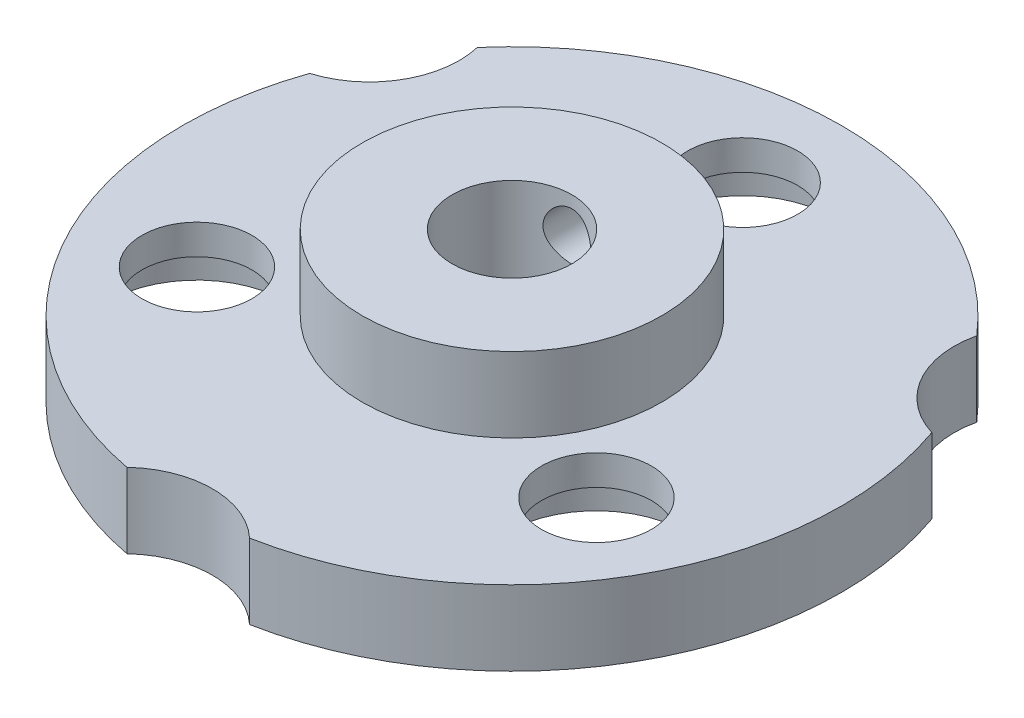
ISO-10303-21;
HEADER;
FILE_DESCRIPTION(('STEP AP214'),'2;1');
FILE_NAME('part.step','',(''),(''),'','','');
FILE_SCHEMA(('AUTOMOTIVE_DESIGN { 1 0 10303 214 1 1 1 1 }'));
ENDSEC;
DATA;
#1=APPLICATION_CONTEXT('core data for automotive mechanical design processes');
#2=APPLICATION_PROTOCOL_DEFINITION('international standard','automotive_design',2000,#1);
#3=PRODUCT_CONTEXT('',#1,'mechanical');
#4=PRODUCT('Part','Part','',(#3));
#5=PRODUCT_RELATED_PRODUCT_CATEGORY('part','',(#4));
#6=PRODUCT_DEFINITION_FORMATION('','',#4);
#7=PRODUCT_DEFINITION_CONTEXT('part definition',#1,'design');
#8=PRODUCT_DEFINITION('design','',#6,#7);
#9=PRODUCT_DEFINITION_SHAPE('','',#8);
#10=(LENGTH_UNIT() NAMED_UNIT(*) SI_UNIT(.MILLI.,.METRE.));
#11=(NAMED_UNIT(*) PLANE_ANGLE_UNIT() SI_UNIT($,.RADIAN.));
#12=(NAMED_UNIT(*) SI_UNIT($,.STERADIAN.) SOLID_ANGLE_UNIT());
#13=UNCERTAINTY_MEASURE_WITH_UNIT(LENGTH_MEASURE(1.E-05),#10,'distance_accuracy_value','');
#14=(GEOMETRIC_REPRESENTATION_CONTEXT(3) GLOBAL_UNCERTAINTY_ASSIGNED_CONTEXT((#13)) GLOBAL_UNIT_ASSIGNED_CONTEXT((#10,
#11,#12)) REPRESENTATION_CONTEXT('',''));
#15=CARTESIAN_POINT('',(0.,0.,0.));
#16=DIRECTION('',(0.,0.,1.));
#17=DIRECTION('',(1.,0.,0.));
#18=AXIS2_PLACEMENT_3D('',#15,#16,#17);
#19=CARTESIAN_POINT('',(0.,0.,-7.7));
#20=DIRECTION('',(0.,1.,0.));
#21=DIRECTION('',(0.,0.,1.));
#22=AXIS2_PLACEMENT_3D('',#19,#20,#21);
#23=CYLINDRICAL_SURFACE('',#22,1.83552150537951);
#24=CARTESIAN_POINT('',(0.,2.5,-7.7));
#25=DIRECTION('',(0.,1.,0.));
#26=DIRECTION('',(0.,0.,1.));
#27=AXIS2_PLACEMENT_3D('',#24,#25,#26);
#28=CIRCLE('',#27,1.83552150537951);
#29=CARTESIAN_POINT('',(0.,2.5,-5.86447849462049));
#30=VERTEX_POINT('',#29);
#31=EDGE_CURVE('E256',#30,#30,#28,.T.);
#32=ORIENTED_EDGE('',*,*,#31,.T.);
#33=EDGE_LOOP('',(#32));
#34=FACE_BOUND('',#33,.T.);
#35=CARTESIAN_POINT('',(0.,1.5,-7.7));
#36=DIRECTION('',(0.,-1.,0.));
#37=DIRECTION('',(0.,0.,-1.));
#38=AXIS2_PLACEMENT_3D('',#35,#36,#37);
#39=CIRCLE('',#38,1.83552150537951);
#40=CARTESIAN_POINT('',(0.,1.5,-9.5355215053795));
#41=VERTEX_POINT('',#40);
#42=EDGE_CURVE('E37',#41,#41,#39,.F.);
#43=ORIENTED_EDGE('',*,*,#42,.F.);
#44=EDGE_LOOP('',(#43));
#45=FACE_BOUND('',#44,.T.);
#46=ADVANCED_FACE('F33',(#34,#45),#23,.F.);
#47=CARTESIAN_POINT('',(-6.66839560914018,0.,3.85));
#48=DIRECTION('',(0.,1.,0.));
#49=DIRECTION('',(0.,0.,1.));
#50=AXIS2_PLACEMENT_3D('',#47,#48,#49);
#51=CYLINDRICAL_SURFACE('',#50,1.83552150537951);
#52=CARTESIAN_POINT('',(-6.66839560914018,2.5,3.85));
#53=DIRECTION('',(0.,1.,0.));
#54=DIRECTION('',(0.,0.,1.));
#55=AXIS2_PLACEMENT_3D('',#52,#53,#54);
#56=CIRCLE('',#55,1.83552150537951);
#57=CARTESIAN_POINT('',(-6.66839560914018,2.5,5.68552150537951));
#58=VERTEX_POINT('',#57);
#59=EDGE_CURVE('E260',#58,#58,#56,.T.);
#60=ORIENTED_EDGE('',*,*,#59,.T.);
#61=EDGE_LOOP('',(#60));
#62=FACE_BOUND('',#61,.T.);
#63=CARTESIAN_POINT('',(-6.66839560914018,1.5,3.85));
#64=DIRECTION('',(0.,-1.,0.));
#65=DIRECTION('',(0.,0.,-1.));
#66=AXIS2_PLACEMENT_3D('',#63,#64,#65);
#67=CIRCLE('',#66,1.83552150537951);
#68=CARTESIAN_POINT('',(-6.66839560914018,1.5,2.0144784946205));
#69=VERTEX_POINT('',#68);
#70=EDGE_CURVE('E127',#69,#69,#67,.F.);
#71=ORIENTED_EDGE('',*,*,#70,.F.);
#72=EDGE_LOOP('',(#71));
#73=FACE_BOUND('',#72,.T.);
#74=ADVANCED_FACE('F218',(#62,#73),#51,.F.);
#75=CARTESIAN_POINT('',(6.66839560914018,0.,3.85));
#76=DIRECTION('',(0.,1.,0.));
#77=DIRECTION('',(0.,0.,1.));
#78=AXIS2_PLACEMENT_3D('',#75,#76,#77);
#79=CYLINDRICAL_SURFACE('',#78,1.83552150537951);
#80=CARTESIAN_POINT('',(6.66839560914018,2.5,3.85));
#81=DIRECTION('',(0.,1.,0.));
#82=DIRECTION('',(0.,0.,1.));
#83=AXIS2_PLACEMENT_3D('',#80,#81,#82);
#84=CIRCLE('',#83,1.83552150537951);
#85=CARTESIAN_POINT('',(6.66839560914018,2.5,5.6855215053795));
#86=VERTEX_POINT('',#85);
#87=EDGE_CURVE('E257',#86,#86,#84,.T.);
#88=ORIENTED_EDGE('',*,*,#87,.T.);
#89=EDGE_LOOP('',(#88));
#90=FACE_BOUND('',#89,.T.);
#91=CARTESIAN_POINT('',(6.66839560914018,1.5,3.85));
#92=DIRECTION('',(0.,-1.,0.));
#93=DIRECTION('',(0.,0.,-1.));
#94=AXIS2_PLACEMENT_3D('',#91,#92,#93);
#95=CIRCLE('',#94,1.83552150537951);
#96=CARTESIAN_POINT('',(6.66839560914018,1.5,2.01447849462049));
#97=VERTEX_POINT('',#96);
#98=EDGE_CURVE('E103',#97,#97,#95,.F.);
#99=ORIENTED_EDGE('',*,*,#98,.F.);
#100=EDGE_LOOP('',(#99));
#101=FACE_BOUND('',#100,.T.);
#102=ADVANCED_FACE('F224',(#90,#101),#79,.F.);
#103=CARTESIAN_POINT('',(0.,2.5,0.));
#104=DIRECTION('',(0.,-1.,0.));
#105=DIRECTION('',(0.,0.,-1.));
#106=AXIS2_PLACEMENT_3D('',#103,#104,#105);
#107=CYLINDRICAL_SURFACE('',#106,11.);
#108=CARTESIAN_POINT('',(0.,0.,0.));
#109=DIRECTION('',(0.,1.,0.));
#110=DIRECTION('',(0.,0.,1.));
#111=AXIS2_PLACEMENT_3D('',#108,#109,#110);
#112=CIRCLE('',#111,11.);
#113=CARTESIAN_POINT('',(2.04787377107266,0.,10.8076923076924));
#114=VERTEX_POINT('',#113);
#115=CARTESIAN_POINT('',(10.3836729802836,0.,-3.63033544435343));
#116=VERTEX_POINT('',#115);
#117=EDGE_CURVE('E112',#114,#116,#112,.T.);
#118=ORIENTED_EDGE('',*,*,#117,.T.);
#119=DIRECTION('',(0.,1.,0.));
#120=VECTOR('',#119,1.);
#121=CARTESIAN_POINT('',(10.3836729802836,-0.25,-3.63033544435342));
#122=LINE('',#121,#120);
#123=CARTESIAN_POINT('',(10.3836729802836,2.5,-3.63033544435342));
#124=VERTEX_POINT('',#123);
#125=EDGE_CURVE('E50',#116,#124,#122,.T.);
#126=ORIENTED_EDGE('',*,*,#125,.T.);
#127=CARTESIAN_POINT('',(0.,2.5,0.));
#128=DIRECTION('',(0.,1.,0.));
#129=DIRECTION('',(0.,0.,1.));
#130=AXIS2_PLACEMENT_3D('',#127,#128,#129);
#131=CIRCLE('',#130,11.);
#132=CARTESIAN_POINT('',(2.04787377107267,2.5,10.8076923076924));
#133=VERTEX_POINT('',#132);
#134=EDGE_CURVE('E102',#133,#124,#131,.T.);
#135=ORIENTED_EDGE('',*,*,#134,.F.);
#136=DIRECTION('',(0.,1.,0.));
#137=VECTOR('',#136,1.);
#138=CARTESIAN_POINT('',(2.04787377107266,-0.25,10.8076923076924));
#139=LINE('',#138,#137);
#140=EDGE_CURVE('E151',#133,#114,#139,.F.);
#141=ORIENTED_EDGE('',*,*,#140,.T.);
#142=EDGE_LOOP('',(#118,#126,#135,#141));
#143=FACE_BOUND('',#142,.T.);
#144=ADVANCED_FACE('F243',(#143),#107,.T.);
#145=CARTESIAN_POINT('',(-10.3836729802836,0.,-3.6303354443534));
#146=VERTEX_POINT('',#145);
#147=CARTESIAN_POINT('',(-2.04787377107266,0.,10.8076923076924));
#148=VERTEX_POINT('',#147);
#149=EDGE_CURVE('E108',#146,#148,#112,.T.);
#150=ORIENTED_EDGE('',*,*,#149,.T.);
#151=DIRECTION('',(0.,1.,0.));
#152=VECTOR('',#151,1.);
#153=CARTESIAN_POINT('',(-2.04787377107266,-0.25,10.8076923076924));
#154=LINE('',#153,#152);
#155=CARTESIAN_POINT('',(-2.04787377107267,2.5,10.8076923076924));
#156=VERTEX_POINT('',#155);
#157=EDGE_CURVE('E57',#148,#156,#154,.T.);
#158=ORIENTED_EDGE('',*,*,#157,.T.);
#159=CARTESIAN_POINT('',(-10.3836729802836,2.5,-3.63033544435341));
#160=VERTEX_POINT('',#159);
#161=EDGE_CURVE('E110',#160,#156,#131,.T.);
#162=ORIENTED_EDGE('',*,*,#161,.F.);
#163=DIRECTION('',(0.,1.,0.));
#164=VECTOR('',#163,1.);
#165=CARTESIAN_POINT('',(-10.3836729802836,-0.25,-3.63033544435341));
#166=LINE('',#165,#164);
#167=EDGE_CURVE('E157',#160,#146,#166,.F.);
#168=ORIENTED_EDGE('',*,*,#167,.T.);
#169=EDGE_LOOP('',(#150,#158,#162,#168));
#170=FACE_BOUND('',#169,.T.);
#171=ADVANCED_FACE('F232',(#170),#107,.T.);
#172=CARTESIAN_POINT('',(0.,2.5,0.));
#173=DIRECTION('',(0.,1.,0.));
#174=DIRECTION('',(0.,0.,1.));
#175=AXIS2_PLACEMENT_3D('',#172,#173,#174);
#176=PLANE('',#175);
#177=CARTESIAN_POINT('',(11.258330249198,2.5,-6.50000000000016));
#178=DIRECTION('',(0.,1.,0.));
#179=DIRECTION('',(0.,0.,1.));
#180=AXIS2_PLACEMENT_3D('',#177,#178,#179);
#181=CIRCLE('',#180,3.);
#182=CARTESIAN_POINT('',(8.33579920921091,2.5,-7.17735686333895));
#183=VERTEX_POINT('',#182);
#184=EDGE_CURVE('E88',#183,#124,#181,.T.);
#185=ORIENTED_EDGE('',*,*,#184,.F.);
#186=CARTESIAN_POINT('',(-8.33579920921092,2.5,-7.17735686333894));
#187=VERTEX_POINT('',#186);
#188=EDGE_CURVE('E98',#183,#187,#131,.T.);
#189=ORIENTED_EDGE('',*,*,#188,.T.);
#190=CARTESIAN_POINT('',(-11.258330249198,2.5,-6.50000000000015));
#191=DIRECTION('',(0.,1.,0.));
#192=DIRECTION('',(0.,0.,1.));
#193=AXIS2_PLACEMENT_3D('',#190,#191,#192);
#194=CIRCLE('',#193,3.);
#195=EDGE_CURVE('E155',#160,#187,#194,.T.);
#196=ORIENTED_EDGE('',*,*,#195,.F.);
#197=ORIENTED_EDGE('',*,*,#161,.T.);
#198=CARTESIAN_POINT('',(0.,2.5,13.0000000000003));
#199=DIRECTION('',(0.,1.,0.));
#200=DIRECTION('',(0.,0.,1.));
#201=AXIS2_PLACEMENT_3D('',#198,#199,#200);
#202=CIRCLE('',#201,3.);
#203=EDGE_CURVE('E149',#133,#156,#202,.T.);
#204=ORIENTED_EDGE('',*,*,#203,.F.);
#205=ORIENTED_EDGE('',*,*,#134,.T.);
#206=EDGE_LOOP('',(#185,#189,#196,#197,#204,#205));
#207=FACE_BOUND('',#206,.T.);
#208=ORIENTED_EDGE('',*,*,#31,.F.);
#209=EDGE_LOOP('',(#208));
#210=FACE_BOUND('',#209,.T.);
#211=ORIENTED_EDGE('',*,*,#87,.F.);
#212=EDGE_LOOP('',(#211));
#213=FACE_BOUND('',#212,.T.);
#214=ORIENTED_EDGE('',*,*,#59,.F.);
#215=EDGE_LOOP('',(#214));
#216=FACE_BOUND('',#215,.T.);
#217=CARTESIAN_POINT('',(0.,2.5,0.));
#218=DIRECTION('',(0.,1.,0.));
#219=DIRECTION('',(0.,0.,1.));
#220=AXIS2_PLACEMENT_3D('',#217,#218,#219);
#221=CIRCLE('',#220,5.);
#222=CARTESIAN_POINT('',(0.,2.5,5.));
#223=VERTEX_POINT('',#222);
#224=EDGE_CURVE('E266',#223,#223,#221,.T.);
#225=ORIENTED_EDGE('',*,*,#224,.F.);
#226=EDGE_LOOP('',(#225));
#227=FACE_BOUND('',#226,.T.);
#228=ADVANCED_FACE('F95',(#207,#210,#213,#216,#227),#176,.T.);
#229=ORIENTED_EDGE('',*,*,#188,.F.);
#230=DIRECTION('',(0.,1.,0.));
#231=VECTOR('',#230,1.);
#232=CARTESIAN_POINT('',(8.33579920921091,-0.25,-7.17735686333894));
#233=LINE('',#232,#231);
#234=CARTESIAN_POINT('',(8.33579920921092,0.,-7.17735686333894));
#235=VERTEX_POINT('',#234);
#236=EDGE_CURVE('E85',#183,#235,#233,.F.);
#237=ORIENTED_EDGE('',*,*,#236,.T.);
#238=CARTESIAN_POINT('',(-8.33579920921091,0.,-7.17735686333895));
#239=VERTEX_POINT('',#238);
#240=EDGE_CURVE('E114',#235,#239,#112,.T.);
#241=ORIENTED_EDGE('',*,*,#240,.T.);
#242=DIRECTION('',(0.,1.,0.));
#243=VECTOR('',#242,1.);
#244=CARTESIAN_POINT('',(-8.33579920921092,-0.25,-7.17735686333895));
#245=LINE('',#244,#243);
#246=EDGE_CURVE('E107',#239,#187,#245,.T.);
#247=ORIENTED_EDGE('',*,*,#246,.T.);
#248=EDGE_LOOP('',(#229,#237,#241,#247));
#249=FACE_BOUND('',#248,.T.);
#250=ADVANCED_FACE('F35',(#249),#107,.T.);
#251=CARTESIAN_POINT('',(0.,0.,0.));
#252=DIRECTION('',(0.,1.,0.));
#253=DIRECTION('',(0.,0.,1.));
#254=AXIS2_PLACEMENT_3D('',#251,#252,#253);
#255=PLANE('',#254);
#256=CARTESIAN_POINT('',(0.,0.,-7.7));
#257=DIRECTION('',(0.,-1.,0.));
#258=DIRECTION('',(0.,0.,-1.));
#259=AXIS2_PLACEMENT_3D('',#256,#257,#258);
#260=CIRCLE('',#259,3.);
#261=CARTESIAN_POINT('',(0.,0.,-10.7));
#262=VERTEX_POINT('',#261);
#263=EDGE_CURVE('E143',#262,#262,#260,.T.);
#264=ORIENTED_EDGE('',*,*,#263,.F.);
#265=EDGE_LOOP('',(#264));
#266=FACE_BOUND('',#265,.T.);
#267=CARTESIAN_POINT('',(-6.66839560914018,0.,3.85));
#268=DIRECTION('',(0.,-1.,0.));
#269=DIRECTION('',(0.,0.,-1.));
#270=AXIS2_PLACEMENT_3D('',#267,#268,#269);
#271=CIRCLE('',#270,3.);
#272=CARTESIAN_POINT('',(-6.66839560914018,0.,0.850000000000001));
#273=VERTEX_POINT('',#272);
#274=EDGE_CURVE('E136',#273,#273,#271,.T.);
#275=ORIENTED_EDGE('',*,*,#274,.F.);
#276=EDGE_LOOP('',(#275));
#277=FACE_BOUND('',#276,.T.);
#278=CARTESIAN_POINT('',(6.66839560914018,0.,3.85));
#279=DIRECTION('',(0.,-1.,0.));
#280=DIRECTION('',(0.,0.,-1.));
#281=AXIS2_PLACEMENT_3D('',#278,#279,#280);
#282=CIRCLE('',#281,3.);
#283=CARTESIAN_POINT('',(6.66839560914018,0.,0.849999999999996));
#284=VERTEX_POINT('',#283);
#285=EDGE_CURVE('E129',#284,#284,#282,.T.);
#286=ORIENTED_EDGE('',*,*,#285,.F.);
#287=EDGE_LOOP('',(#286));
#288=FACE_BOUND('',#287,.T.);
#289=CARTESIAN_POINT('',(0.,0.,0.));
#290=DIRECTION('',(0.,1.,0.));
#291=DIRECTION('',(0.,0.,1.));
#292=AXIS2_PLACEMENT_3D('',#289,#290,#291);
#293=CIRCLE('',#292,2.);
#294=CARTESIAN_POINT('',(0.,0.,2.));
#295=VERTEX_POINT('',#294);
#296=EDGE_CURVE('E253',#295,#295,#293,.T.);
#297=ORIENTED_EDGE('',*,*,#296,.T.);
#298=EDGE_LOOP('',(#297));
#299=FACE_BOUND('',#298,.T.);
#300=ORIENTED_EDGE('',*,*,#240,.F.);
#301=CARTESIAN_POINT('',(11.258330249198,0.,-6.50000000000016));
#302=DIRECTION('',(0.,1.,0.));
#303=DIRECTION('',(0.,0.,1.));
#304=AXIS2_PLACEMENT_3D('',#301,#302,#303);
#305=CIRCLE('',#304,3.);
#306=EDGE_CURVE('E11',#235,#116,#305,.T.);
#307=ORIENTED_EDGE('',*,*,#306,.T.);
#308=ORIENTED_EDGE('',*,*,#117,.F.);
#309=CARTESIAN_POINT('',(0.,0.,13.0000000000003));
#310=DIRECTION('',(0.,1.,0.));
#311=DIRECTION('',(0.,0.,1.));
#312=AXIS2_PLACEMENT_3D('',#309,#310,#311);
#313=CIRCLE('',#312,3.);
#314=EDGE_CURVE('E42',#114,#148,#313,.T.);
#315=ORIENTED_EDGE('',*,*,#314,.T.);
#316=ORIENTED_EDGE('',*,*,#149,.F.);
#317=CARTESIAN_POINT('',(-11.258330249198,0.,-6.50000000000015));
#318=DIRECTION('',(0.,1.,0.));
#319=DIRECTION('',(0.,0.,1.));
#320=AXIS2_PLACEMENT_3D('',#317,#318,#319);
#321=CIRCLE('',#320,3.);
#322=EDGE_CURVE('E117',#146,#239,#321,.T.);
#323=ORIENTED_EDGE('',*,*,#322,.T.);
#324=EDGE_LOOP('',(#300,#307,#308,#315,#316,#323));
#325=FACE_BOUND('',#324,.T.);
#326=ADVANCED_FACE('F233',(#266,#277,#288,#299,#325),#255,.F.);
#327=CARTESIAN_POINT('',(0.,5.,0.));
#328=DIRECTION('',(0.,-1.,0.));
#329=DIRECTION('',(0.,0.,-1.));
#330=AXIS2_PLACEMENT_3D('',#327,#328,#329);
#331=CYLINDRICAL_SURFACE('',#330,5.);
#332=CARTESIAN_POINT('',(0.,4.59295521709407,-5.));
#333=CARTESIAN_POINT('',(-0.0446345464348316,4.59280840972483,-4.99999925421206));
#334=CARTESIAN_POINT('',(-0.0892819443510242,4.58891705369241,-4.9993960875234));
#335=CARTESIAN_POINT('',(-0.177301891678728,4.57375034444032,-4.99704993433986));
#336=CARTESIAN_POINT('',(-0.220673197606512,4.56246802289334,-4.99530587219164));
#337=CARTESIAN_POINT('',(-0.304854977903623,4.53286726162526,-4.99087558705497));
#338=CARTESIAN_POINT('',(-0.345667459361672,4.51455441889718,-4.98819011367073));
#339=CARTESIAN_POINT('',(-0.423635297501168,4.47142634078325,-4.98217463731942));
#340=CARTESIAN_POINT('',(-0.460791109846802,4.44661191698616,-4.97884471481213));
#341=CARTESIAN_POINT('',(-0.530725668288756,4.39095066663555,-4.97187860497349));
#342=CARTESIAN_POINT('',(-0.563467348194365,4.36005754142336,-4.96824019736804));
#343=CARTESIAN_POINT('',(-0.623325168104831,4.29321676146511,-4.96108624127247));
#344=CARTESIAN_POINT('',(-0.65044097100112,4.25726880404452,-4.95757070015512));
#345=CARTESIAN_POINT('',(-0.698418461816593,4.18109293926852,-4.95104061891818));
#346=CARTESIAN_POINT('',(-0.719244831066636,4.1408425198778,-4.94802894895029));
#347=CARTESIAN_POINT('',(-0.753826505269509,4.0573583918758,-4.9428790397377));
#348=CARTESIAN_POINT('',(-0.767582254949823,4.01412487108954,-4.94074074556118));
#349=CARTESIAN_POINT('',(-0.787517076478005,3.9262960935183,-4.93760253956309));
#350=CARTESIAN_POINT('',(-0.793760297058812,3.88171574712982,-4.93659299479914));
#351=CARTESIAN_POINT('',(-0.798690889447807,3.79212975820018,-4.93579776042976));
#352=CARTESIAN_POINT('',(-0.797378748811149,3.74712414328914,-4.9360119918528));
#353=CARTESIAN_POINT('',(-0.787288858704428,3.65841063797979,-4.93763113481972));
#354=CARTESIAN_POINT('',(-0.778581283745994,3.61469453280229,-4.93902485388638));
#355=CARTESIAN_POINT('',(-0.754056623447392,3.52935153996084,-4.94282826426096));
#356=CARTESIAN_POINT('',(-0.738239305621584,3.48772472066515,-4.94523798879167));
#357=CARTESIAN_POINT('',(-0.699868024192296,3.40752234623804,-4.95081411790351));
#358=CARTESIAN_POINT('',(-0.677283485215569,3.36896166684932,-4.9539839434747));
#359=CARTESIAN_POINT('',(-0.626041212269116,3.29614996590887,-4.9607195182505));
#360=CARTESIAN_POINT('',(-0.597383026549834,3.26189926522965,-4.96428529689616));
#361=CARTESIAN_POINT('',(-0.534418967683776,3.19827161328361,-4.97145948250141));
#362=CARTESIAN_POINT('',(-0.50005254880277,3.16895454552508,-4.97506791289196));
#363=CARTESIAN_POINT('',(-0.42685535233901,3.1164946643916,-4.98188150665978));
#364=CARTESIAN_POINT('',(-0.38802455481584,3.09335187859599,-4.98508666823568));
#365=CARTESIAN_POINT('',(-0.306953152851501,3.05389666610303,-4.99073439993172));
#366=CARTESIAN_POINT('',(-0.264710579067384,3.03758821841365,-4.99317652559617));
#367=CARTESIAN_POINT('',(-0.178038476907495,3.0123135850691,-4.99701733008075));
#368=CARTESIAN_POINT('',(-0.13360911778908,3.00334683211061,-4.99841608952256));
#369=CARTESIAN_POINT('',(-0.044342834257701,2.99308885599945,-5.00000045238604));
#370=CARTESIAN_POINT('',(0.000484388161033505,2.99171513888676,-5.00019909658237));
#371=CARTESIAN_POINT('',(0.0897277032897241,2.99646392886732,-4.99939398406668));
#372=CARTESIAN_POINT('',(0.134143810122924,3.00258617747796,-4.99839026881552));
#373=CARTESIAN_POINT('',(0.22105882533659,3.02208504347061,-4.99529929653219));
#374=CARTESIAN_POINT('',(0.263566806501662,3.03542223188221,-4.99321793138338));
#375=CARTESIAN_POINT('',(0.345743289629188,3.06893109522977,-4.98820186778873));
#376=CARTESIAN_POINT('',(0.385411640694738,3.08910313304104,-4.98526712403657));
#377=CARTESIAN_POINT('',(0.461145134721015,3.13590295965188,-4.97883553280157));
#378=CARTESIAN_POINT('',(0.497177643904882,3.16258293348531,-4.97533422270727));
#379=CARTESIAN_POINT('',(0.564283089849041,3.22156791963511,-4.9681712513089));
#380=CARTESIAN_POINT('',(0.5953556984032,3.25387330390017,-4.9645095794138));
#381=CARTESIAN_POINT('',(0.651957795364867,3.3235577117943,-4.9573959412819));
#382=CARTESIAN_POINT('',(0.677432262603727,3.36098169719568,-4.95394627756548));
#383=CARTESIAN_POINT('',(0.721732833216672,3.43962673186725,-4.9476867714127));
#384=CARTESIAN_POINT('',(0.740559142226743,3.48084766364334,-4.94487690918741));
#385=CARTESIAN_POINT('',(0.770943170127828,3.56575058190925,-4.94023112007101));
#386=CARTESIAN_POINT('',(0.782530149288916,3.60942187342313,-4.93839127728325));
#387=CARTESIAN_POINT('',(0.798199803671995,3.69812236414841,-4.93588301608632));
#388=CARTESIAN_POINT('',(0.80228307355758,3.74315145546765,-4.93521450485016));
#389=CARTESIAN_POINT('',(0.802815962429547,3.83273817599765,-4.93512779371066));
#390=CARTESIAN_POINT('',(0.799352463469281,3.87729529912648,-4.93569536340789));
#391=CARTESIAN_POINT('',(0.785075890692146,3.96518430315666,-4.93798615841887));
#392=CARTESIAN_POINT('',(0.774262828172747,4.00851618594129,-4.93970938195619));
#393=CARTESIAN_POINT('',(0.745624187596051,4.09270216575181,-4.94411292837317));
#394=CARTESIAN_POINT('',(0.72780443654043,4.1335582892027,-4.94679245578731));
#395=CARTESIAN_POINT('',(0.685666554935636,4.21171525048427,-4.9528085340871));
#396=CARTESIAN_POINT('',(0.661348141854871,4.24901593364528,-4.95614511353666));
#397=CARTESIAN_POINT('',(0.606587081465112,4.3194447098727,-4.96314620762862));
#398=CARTESIAN_POINT('',(0.576080086044314,4.3525224588935,-4.9668139223735));
#399=CARTESIAN_POINT('',(0.509945409149723,4.41311877418437,-4.97403858748415));
#400=CARTESIAN_POINT('',(0.474316548786267,4.44063605709539,-4.97759551211962));
#401=CARTESIAN_POINT('',(0.398688189514486,4.48948390134341,-4.98422474154444));
#402=CARTESIAN_POINT('',(0.358663017320115,4.51077513877548,-4.98729391237595));
#403=CARTESIAN_POINT('',(0.275572401990431,4.54629917536374,-4.99257309312883));
#404=CARTESIAN_POINT('',(0.232510090751467,4.56053912765659,-4.9947839732444));
#405=CARTESIAN_POINT('',(0.157722389070858,4.57841711433275,-4.99760747858701));
#406=CARTESIAN_POINT('',(0.12644710954531,4.58395060419822,-4.99850013479712));
#407=CARTESIAN_POINT('',(0.0634500468027396,4.59127180597416,-4.99969665612681));
#408=CARTESIAN_POINT('',(0.0317282703374389,4.59305957446456,-5.00000053014007));
#409=CARTESIAN_POINT('',(0.,4.59295521709407,-5.));
#410=B_SPLINE_CURVE_WITH_KNOTS('',3,(#332,#333,#334,#335,#336,#337,#338,#339,#340,#341,#342,
#343,#344,#345,#346,#347,#348,#349,#350,#351,#352,#353,#354,#355,#356,#357,#358,#359,#360,#361,
#362,#363,#364,#365,#366,#367,#368,#369,#370,#371,#372,#373,#374,#375,#376,#377,#378,#379,#380,
#381,#382,#383,#384,#385,#386,#387,#388,#389,#390,#391,#392,#393,#394,#395,#396,#397,#398,#399,
#400,#401,#402,#403,#404,#405,#406,#407,#408,#409),.UNSPECIFIED.,.T.,.F.,(4,2,2,2,2,2,2,2,2,2,2,
2,2,2,2,2,2,2,2,2,2,2,2,2,2,2,2,2,2,2,2,2,2,2,2,2,2,2,4),(0.,0.13378838513054,0.267703090104947,
0.401511406008695,0.53530302664602,0.67015614056743,0.805017332699413,0.940622335585658,
1.07621880815102,1.21064902767123,1.34507057236969,1.47823067492863,1.61139513208443,
1.74517055974791,1.87895594093933,2.0142634358785,2.1495715352002,2.28495830293329,
2.42033460814825,2.5542371933749,2.68813516138256,2.82130867464519,2.9544892594542,
3.08877506801447,3.22306975884367,3.35863055099062,3.49418714970259,3.62919224330306,
3.76418663738493,3.89763512942673,4.03108341633702,4.16442095702511,4.2977642955525,
4.43257259927339,4.56741198138661,4.70308547687108,4.83862105572566,4.93372537539903,
5.02882825849047),.UNSPECIFIED.);
#411=CARTESIAN_POINT('',(0.,4.59295521709407,-5.));
#412=VERTEX_POINT('',#411);
#413=EDGE_CURVE('E168',#412,#412,#410,.T.);
#414=ORIENTED_EDGE('',*,*,#413,.T.);
#415=EDGE_LOOP('',(#414));
#416=FACE_BOUND('',#415,.T.);
#417=CARTESIAN_POINT('',(0.,5.,0.));
#418=DIRECTION('',(0.,1.,0.));
#419=DIRECTION('',(0.,0.,1.));
#420=AXIS2_PLACEMENT_3D('',#417,#418,#419);
#421=CIRCLE('',#420,5.);
#422=CARTESIAN_POINT('',(0.,5.,5.));
#423=VERTEX_POINT('',#422);
#424=EDGE_CURVE('E265',#423,#423,#421,.T.);
#425=ORIENTED_EDGE('',*,*,#424,.F.);
#426=EDGE_LOOP('',(#425));
#427=FACE_BOUND('',#426,.T.);
#428=ORIENTED_EDGE('',*,*,#224,.T.);
#429=EDGE_LOOP('',(#428));
#430=FACE_BOUND('',#429,.T.);
#431=ADVANCED_FACE('F235',(#416,#427,#430),#331,.T.);
#432=CARTESIAN_POINT('',(0.,5.,0.));
#433=DIRECTION('',(0.,1.,0.));
#434=DIRECTION('',(0.,0.,1.));
#435=AXIS2_PLACEMENT_3D('',#432,#433,#434);
#436=PLANE('',#435);
#437=CARTESIAN_POINT('',(0.,5.,0.));
#438=DIRECTION('',(0.,1.,0.));
#439=DIRECTION('',(0.,0.,1.));
#440=AXIS2_PLACEMENT_3D('',#437,#438,#439);
#441=CIRCLE('',#440,2.);
#442=CARTESIAN_POINT('',(0.,5.,2.));
#443=VERTEX_POINT('',#442);
#444=EDGE_CURVE('E271',#443,#443,#441,.T.);
#445=ORIENTED_EDGE('',*,*,#444,.F.);
#446=EDGE_LOOP('',(#445));
#447=FACE_BOUND('',#446,.T.);
#448=ORIENTED_EDGE('',*,*,#424,.T.);
#449=EDGE_LOOP('',(#448));
#450=FACE_BOUND('',#449,.T.);
#451=ADVANCED_FACE('F241',(#447,#450),#436,.T.);
#452=CARTESIAN_POINT('',(0.,-0.5,0.));
#453=DIRECTION('',(0.,1.,0.));
#454=DIRECTION('',(0.,0.,1.));
#455=AXIS2_PLACEMENT_3D('',#452,#453,#454);
#456=CYLINDRICAL_SURFACE('',#455,2.);
#457=CARTESIAN_POINT('',(-0.799047163232818,3.79295943814312,-1.83344583528655));
#458=CARTESIAN_POINT('',(-0.799042462665129,3.83581523738308,-1.83345016148733));
#459=CARTESIAN_POINT('',(-0.795582298961549,3.878731652025,-1.83496816656248));
#460=CARTESIAN_POINT('',(-0.781870924640441,3.96333337129395,-1.84085028760057));
#461=CARTESIAN_POINT('',(-0.771602360737395,4.00501524497531,-1.84522167583811));
#462=CARTESIAN_POINT('',(-0.744729327155326,4.08578061493114,-1.85622915151898));
#463=CARTESIAN_POINT('',(-0.728148728191182,4.12487325708722,-1.86285669680964));
#464=CARTESIAN_POINT('',(-0.689192297844297,4.19971345848697,-1.87761712591288));
#465=CARTESIAN_POINT('',(-0.666817731835192,4.23546174580346,-1.88574968092829));
#466=CARTESIAN_POINT('',(-0.61553971281123,4.3046635990397,-1.90312364779918));
#467=CARTESIAN_POINT('',(-0.58635784032435,4.33790200731491,-1.91240069322624));
#468=CARTESIAN_POINT('',(-0.522880208430892,4.39917103706927,-1.93072185889342));
#469=CARTESIAN_POINT('',(-0.488582669464804,4.42719983865906,-1.93976589678943));
#470=CARTESIAN_POINT('',(-0.414185402195358,4.4783219969362,-1.95702917136805));
#471=CARTESIAN_POINT('',(-0.373910211072265,4.50117715873138,-1.96520182230166));
#472=CARTESIAN_POINT('',(-0.289701380398092,4.53969686549904,-1.97936655195159));
#473=CARTESIAN_POINT('',(-0.245769238148499,4.5553643364559,-1.9853595177737));
#474=CARTESIAN_POINT('',(-0.157750075902051,4.57829603271808,-1.99423556096864));
#475=CARTESIAN_POINT('',(-0.113773523697688,4.58593036377873,-1.99725515136257));
#476=CARTESIAN_POINT('',(-0.0250668487170981,4.5937708324082,-2.00033454157052));
#477=CARTESIAN_POINT('',(0.0196629867650228,4.59397974051706,-2.00039544531936));
#478=CARTESIAN_POINT('',(0.105931294208234,4.58716633023313,-1.99763306267521));
#479=CARTESIAN_POINT('',(0.147507899770072,4.58054952904435,-1.99497158842065));
#480=CARTESIAN_POINT('',(0.228902174751906,4.56096228761882,-1.98727846099662));
#481=CARTESIAN_POINT('',(0.268719714875988,4.54799138118296,-1.98224663391601));
#482=CARTESIAN_POINT('',(0.346183249643455,4.5159048449926,-1.97020763308979));
#483=CARTESIAN_POINT('',(0.383787471768839,4.49669955221691,-1.96317183115119));
#484=CARTESIAN_POINT('',(0.455335714177723,4.45277343537552,-1.94782194029242));
#485=CARTESIAN_POINT('',(0.489278474026521,4.42805072090407,-1.93950741355362));
#486=CARTESIAN_POINT('',(0.554906472629294,4.37189978376448,-1.92179839226061));
#487=CARTESIAN_POINT('',(0.5862971827107,4.34013788110959,-1.91236883284082));
#488=CARTESIAN_POINT('',(0.643427425666816,4.27176320941473,-1.89391247433249));
#489=CARTESIAN_POINT('',(0.669165108827851,4.23514885888145,-1.88488580784111));
#490=CARTESIAN_POINT('',(0.714932684947926,4.15679182917954,-1.86801625144648));
#491=CARTESIAN_POINT('',(0.734780817558316,4.11493350594959,-1.86021400116244));
#492=CARTESIAN_POINT('',(0.767030676121989,4.02807324195832,-1.84715194248046));
#493=CARTESIAN_POINT('',(0.779437238497369,3.98307336423478,-1.8418904832071));
#494=CARTESIAN_POINT('',(0.795735790485013,3.8941451271687,-1.83490569798837));
#495=CARTESIAN_POINT('',(0.800101652415495,3.85031925929505,-1.83298585564763));
#496=CARTESIAN_POINT('',(0.801577009622713,3.76252855503594,-1.83234161445076));
#497=CARTESIAN_POINT('',(0.798688705387978,3.71856376483198,-1.83361624657819));
#498=CARTESIAN_POINT('',(0.786169103831121,3.63437586416117,-1.83901580962576));
#499=CARTESIAN_POINT('',(0.776931226908908,3.59408226318332,-1.84297426536607));
#500=CARTESIAN_POINT('',(0.752484930936957,3.51564407622872,-1.85308934576475));
#501=CARTESIAN_POINT('',(0.737275188035647,3.4774999689002,-1.85924645779688));
#502=CARTESIAN_POINT('',(0.700628046591326,3.40271849502493,-1.8733712247657));
#503=CARTESIAN_POINT('',(0.678963109315052,3.36620496266534,-1.88140217745099));
#504=CARTESIAN_POINT('',(0.630252814553537,3.29716624316645,-1.89827421927866));
#505=CARTESIAN_POINT('',(0.603205265897456,3.26464268902488,-1.90711563755479));
#506=CARTESIAN_POINT('',(0.542138497452123,3.20201007470344,-1.92540214415289));
#507=CARTESIAN_POINT('',(0.507751887159073,3.17225681202671,-1.93484358333461));
#508=CARTESIAN_POINT('',(0.434248415737529,3.11888860749899,-1.95265373874898));
#509=CARTESIAN_POINT('',(0.395131362162266,3.09527391550423,-1.96102241131014));
#510=CARTESIAN_POINT('',(0.31313893568456,3.05494038755863,-1.97577237459626));
#511=CARTESIAN_POINT('',(0.270264465652491,3.03821990047681,-1.98215414108649));
#512=CARTESIAN_POINT('',(0.181992917293087,3.01233989718007,-1.99219653103666));
#513=CARTESIAN_POINT('',(0.136597222310328,3.00317627756709,-1.9958586311747));
#514=CARTESIAN_POINT('',(0.0477660664283575,2.99315755749297,-1.99989147626839));
#515=CARTESIAN_POINT('',(0.00439594967590276,2.99179938675806,-2.0004613723665));
#516=CARTESIAN_POINT('',(-0.0819346635675842,2.99610162985676,-1.99878702553996));
#517=CARTESIAN_POINT('',(-0.124895221072546,3.00176098125737,-1.99654320860292));
#518=CARTESIAN_POINT('',(-0.20783428501033,3.01957815348651,-1.98959434533991));
#519=CARTESIAN_POINT('',(-0.247863856579023,3.03153101657334,-1.98496701941007));
#520=CARTESIAN_POINT('',(-0.325343117641277,3.06138055996785,-1.97374915700592));
#521=CARTESIAN_POINT('',(-0.362792329762865,3.07927833655126,-1.96715825846082));
#522=CARTESIAN_POINT('',(-0.435866556162932,3.12140071753886,-1.95229918545447));
#523=CARTESIAN_POINT('',(-0.471337828202997,3.14586995609716,-1.94396976221287));
#524=CARTESIAN_POINT('',(-0.537820302467071,3.2000748458147,-1.9266374083776));
#525=CARTESIAN_POINT('',(-0.568829649016991,3.22981267672717,-1.91763419991543));
#526=CARTESIAN_POINT('',(-0.627493429707887,3.29588552795314,-1.89927745433076));
#527=CARTESIAN_POINT('',(-0.654821337141413,3.33251498750356,-1.88993673310011));
#528=CARTESIAN_POINT('',(-0.702965798364049,3.41013629311463,-1.8725643096112));
#529=CARTESIAN_POINT('',(-0.723781586606339,3.45112865130706,-1.86453276130882));
#530=CARTESIAN_POINT('',(-0.756634245727276,3.53257431888235,-1.85142897319136));
#531=CARTESIAN_POINT('',(-0.769291558814078,3.57274553204359,-1.84615576781002));
#532=CARTESIAN_POINT('',(-0.788131797050599,3.65475360599526,-1.83819389903301));
#533=CARTESIAN_POINT('',(-0.794332763107594,3.69658548452991,-1.83549803553178));
#534=CARTESIAN_POINT('',(-0.798432727575449,3.75671046307829,-1.83371307301415));
#535=CARTESIAN_POINT('',(-0.799049151782284,3.77482952654216,-1.83344400511095));
#536=CARTESIAN_POINT('',(-0.799047163232818,3.79295943814312,-1.83344583528655));
#537=B_SPLINE_CURVE_WITH_KNOTS('',3,(#457,#458,#459,#460,#461,#462,#463,#464,#465,#466,#467,
#468,#469,#470,#471,#472,#473,#474,#475,#476,#477,#478,#479,#480,#481,#482,#483,#484,#485,#486,
#487,#488,#489,#490,#491,#492,#493,#494,#495,#496,#497,#498,#499,#500,#501,#502,#503,#504,#505,
#506,#507,#508,#509,#510,#511,#512,#513,#514,#515,#516,#517,#518,#519,#520,#521,#522,#523,#524,
#525,#526,#527,#528,#529,#530,#531,#532,#533,#534,#535,#536),.UNSPECIFIED.,.T.,.F.,(4,2,2,2,2,2,
2,2,2,2,2,2,2,2,2,2,2,2,2,2,2,2,2,2,2,2,2,2,2,2,2,2,2,2,2,2,2,2,2,4),(0.,0.128511059507061,
0.257350934328898,0.385708329317355,0.514037715295445,0.649022473137699,0.784054297393369,
0.924410676365712,1.06470986787792,1.19821673154873,1.33167378122269,1.45763457932121,
1.58360462051624,1.71147320093959,1.83938565976012,1.97569617632542,2.11205122850851,
2.2522578348583,2.39237321917645,2.52392859007372,2.6554440596078,2.77946899231662,
2.90352143458259,3.03260461858684,3.16174045807944,3.30041493696396,3.43909505938703,
3.57774194922729,3.71631350379258,3.84584415899985,3.97535520602644,4.10088797774945,
4.22644391129038,4.35754820453574,4.48870686623286,4.62798501311849,4.76727952701279,
4.89406664325234,5.02049852085301,5.07486442208293),.UNSPECIFIED.);
#538=CARTESIAN_POINT('',(-0.799047163232818,3.79295943814312,-1.83344583528655));
#539=VERTEX_POINT('',#538);
#540=EDGE_CURVE('E161',#539,#539,#537,.T.);
#541=ORIENTED_EDGE('',*,*,#540,.T.);
#542=EDGE_LOOP('',(#541));
#543=FACE_BOUND('',#542,.T.);
#544=ORIENTED_EDGE('',*,*,#444,.T.);
#545=EDGE_LOOP('',(#544));
#546=FACE_BOUND('',#545,.T.);
#547=ORIENTED_EDGE('',*,*,#296,.F.);
#548=EDGE_LOOP('',(#547));
#549=FACE_BOUND('',#548,.T.);
#550=ADVANCED_FACE('F180',(#543,#546,#549),#456,.F.);
#551=CARTESIAN_POINT('',(0.002598780609484,3.79295943814312,-4.99999932463389));
#552=DIRECTION('',(0.000519756121896799,0.,-0.999999864926778));
#553=DIRECTION('',(-0.999999864926778,0.,-0.000519756121896799));
#554=AXIS2_PLACEMENT_3D('',#551,#552,#553);
#555=CYLINDRICAL_SURFACE('',#554,0.799999999999999);
#556=ORIENTED_EDGE('',*,*,#540,.F.);
#557=EDGE_LOOP('',(#556));
#558=FACE_BOUND('',#557,.T.);
#559=ORIENTED_EDGE('',*,*,#413,.F.);
#560=EDGE_LOOP('',(#559));
#561=FACE_BOUND('',#560,.T.);
#562=ADVANCED_FACE('F175',(#558,#561),#555,.F.);
#563=CARTESIAN_POINT('',(-11.258330249198,-3.,-6.50000000000015));
#564=DIRECTION('',(0.,1.,0.));
#565=DIRECTION('',(0.,0.,1.));
#566=AXIS2_PLACEMENT_3D('',#563,#564,#565);
#567=CYLINDRICAL_SURFACE('',#566,3.);
#568=ORIENTED_EDGE('',*,*,#322,.F.);
#569=ORIENTED_EDGE('',*,*,#167,.F.);
#570=ORIENTED_EDGE('',*,*,#195,.T.);
#571=ORIENTED_EDGE('',*,*,#246,.F.);
#572=EDGE_LOOP('',(#568,#569,#570,#571));
#573=FACE_BOUND('',#572,.T.);
#574=ADVANCED_FACE('F179',(#573),#567,.F.);
#575=CARTESIAN_POINT('',(0.,-3.,13.0000000000003));
#576=DIRECTION('',(0.,1.,0.));
#577=DIRECTION('',(0.,0.,1.));
#578=AXIS2_PLACEMENT_3D('',#575,#576,#577);
#579=CYLINDRICAL_SURFACE('',#578,3.);
#580=ORIENTED_EDGE('',*,*,#314,.F.);
#581=ORIENTED_EDGE('',*,*,#140,.F.);
#582=ORIENTED_EDGE('',*,*,#203,.T.);
#583=ORIENTED_EDGE('',*,*,#157,.F.);
#584=EDGE_LOOP('',(#580,#581,#582,#583));
#585=FACE_BOUND('',#584,.T.);
#586=ADVANCED_FACE('F185',(#585),#579,.F.);
#587=CARTESIAN_POINT('',(11.258330249198,-3.,-6.50000000000016));
#588=DIRECTION('',(0.,1.,0.));
#589=DIRECTION('',(0.,0.,1.));
#590=AXIS2_PLACEMENT_3D('',#587,#588,#589);
#591=CYLINDRICAL_SURFACE('',#590,3.);
#592=ORIENTED_EDGE('',*,*,#306,.F.);
#593=ORIENTED_EDGE('',*,*,#236,.F.);
#594=ORIENTED_EDGE('',*,*,#184,.T.);
#595=ORIENTED_EDGE('',*,*,#125,.F.);
#596=EDGE_LOOP('',(#592,#593,#594,#595));
#597=FACE_BOUND('',#596,.T.);
#598=ADVANCED_FACE('F87',(#597),#591,.F.);
#599=CARTESIAN_POINT('',(6.66839560914018,1.5,3.85));
#600=DIRECTION('',(0.,-1.,0.));
#601=DIRECTION('',(0.,0.,-1.));
#602=AXIS2_PLACEMENT_3D('',#599,#600,#601);
#603=PLANE('',#602);
#604=CARTESIAN_POINT('',(6.66839560914018,1.5,3.85));
#605=DIRECTION('',(0.,-1.,0.));
#606=DIRECTION('',(0.,0.,-1.));
#607=AXIS2_PLACEMENT_3D('',#604,#605,#606);
#608=CIRCLE('',#607,3.);
#609=CARTESIAN_POINT('',(6.66839560914018,1.5,0.849999999999996));
#610=VERTEX_POINT('',#609);
#611=EDGE_CURVE('E126',#610,#610,#608,.T.);
#612=ORIENTED_EDGE('',*,*,#611,.T.);
#613=EDGE_LOOP('',(#612));
#614=FACE_BOUND('',#613,.T.);
#615=ORIENTED_EDGE('',*,*,#98,.T.);
#616=EDGE_LOOP('',(#615));
#617=FACE_BOUND('',#616,.T.);
#618=ADVANCED_FACE('F191',(#614,#617),#603,.T.);
#619=CARTESIAN_POINT('',(6.66839560914018,1.5,3.85));
#620=DIRECTION('',(0.,-1.,0.));
#621=DIRECTION('',(0.,0.,-1.));
#622=AXIS2_PLACEMENT_3D('',#619,#620,#621);
#623=CYLINDRICAL_SURFACE('',#622,3.);
#624=ORIENTED_EDGE('',*,*,#611,.F.);
#625=EDGE_LOOP('',(#624));
#626=FACE_BOUND('',#625,.T.);
#627=ORIENTED_EDGE('',*,*,#285,.T.);
#628=EDGE_LOOP('',(#627));
#629=FACE_BOUND('',#628,.T.);
#630=ADVANCED_FACE('F192',(#626,#629),#623,.F.);
#631=CARTESIAN_POINT('',(-6.66839560914018,1.5,3.85));
#632=DIRECTION('',(0.,-1.,0.));
#633=DIRECTION('',(0.,0.,-1.));
#634=AXIS2_PLACEMENT_3D('',#631,#632,#633);
#635=PLANE('',#634);
#636=CARTESIAN_POINT('',(-6.66839560914018,1.5,3.85));
#637=DIRECTION('',(0.,-1.,0.));
#638=DIRECTION('',(0.,0.,-1.));
#639=AXIS2_PLACEMENT_3D('',#636,#637,#638);
#640=CIRCLE('',#639,3.);
#641=CARTESIAN_POINT('',(-6.66839560914018,1.5,0.850000000000001));
#642=VERTEX_POINT('',#641);
#643=EDGE_CURVE('E130',#642,#642,#640,.T.);
#644=ORIENTED_EDGE('',*,*,#643,.T.);
#645=EDGE_LOOP('',(#644));
#646=FACE_BOUND('',#645,.T.);
#647=ORIENTED_EDGE('',*,*,#70,.T.);
#648=EDGE_LOOP('',(#647));
#649=FACE_BOUND('',#648,.T.);
#650=ADVANCED_FACE('F195',(#646,#649),#635,.T.);
#651=CARTESIAN_POINT('',(-6.66839560914018,1.5,3.85));
#652=DIRECTION('',(0.,-1.,0.));
#653=DIRECTION('',(0.,0.,-1.));
#654=AXIS2_PLACEMENT_3D('',#651,#652,#653);
#655=CYLINDRICAL_SURFACE('',#654,3.);
#656=ORIENTED_EDGE('',*,*,#643,.F.);
#657=EDGE_LOOP('',(#656));
#658=FACE_BOUND('',#657,.T.);
#659=ORIENTED_EDGE('',*,*,#274,.T.);
#660=EDGE_LOOP('',(#659));
#661=FACE_BOUND('',#660,.T.);
#662=ADVANCED_FACE('F200',(#658,#661),#655,.F.);
#663=CARTESIAN_POINT('',(0.,1.5,-7.7));
#664=DIRECTION('',(0.,-1.,0.));
#665=DIRECTION('',(0.,0.,-1.));
#666=AXIS2_PLACEMENT_3D('',#663,#664,#665);
#667=PLANE('',#666);
#668=CARTESIAN_POINT('',(0.,1.5,-7.7));
#669=DIRECTION('',(0.,-1.,0.));
#670=DIRECTION('',(0.,0.,-1.));
#671=AXIS2_PLACEMENT_3D('',#668,#669,#670);
#672=CIRCLE('',#671,3.);
#673=CARTESIAN_POINT('',(0.,1.5,-10.7));
#674=VERTEX_POINT('',#673);
#675=EDGE_CURVE('E429',#674,#674,#672,.T.);
#676=ORIENTED_EDGE('',*,*,#675,.T.);
#677=EDGE_LOOP('',(#676));
#678=FACE_BOUND('',#677,.T.);
#679=ORIENTED_EDGE('',*,*,#42,.T.);
#680=EDGE_LOOP('',(#679));
#681=FACE_BOUND('',#680,.T.);
#682=ADVANCED_FACE('F203',(#678,#681),#667,.T.);
#683=CARTESIAN_POINT('',(0.,1.5,-7.7));
#684=DIRECTION('',(0.,-1.,0.));
#685=DIRECTION('',(0.,0.,-1.));
#686=AXIS2_PLACEMENT_3D('',#683,#684,#685);
#687=CYLINDRICAL_SURFACE('',#686,3.);
#688=ORIENTED_EDGE('',*,*,#675,.F.);
#689=EDGE_LOOP('',(#688));
#690=FACE_BOUND('',#689,.T.);
#691=ORIENTED_EDGE('',*,*,#263,.T.);
#692=EDGE_LOOP('',(#691));
#693=FACE_BOUND('',#692,.T.);
#694=ADVANCED_FACE('F207',(#690,#693),#687,.F.);
#695=CLOSED_SHELL('',(#46,#74,#102,#144,#171,#228,#250,#326,#431,#451,#550,#562,#574,#586,#598,
#618,#630,#650,#662,#682,#694));
#696=MANIFOLD_SOLID_BREP('B2',#695);
#697=ADVANCED_BREP_SHAPE_REPRESENTATION('',(#18,#696),#14);
#698=SHAPE_DEFINITION_REPRESENTATION(#9,#697);
ENDSEC;
END-ISO-10303-21;
